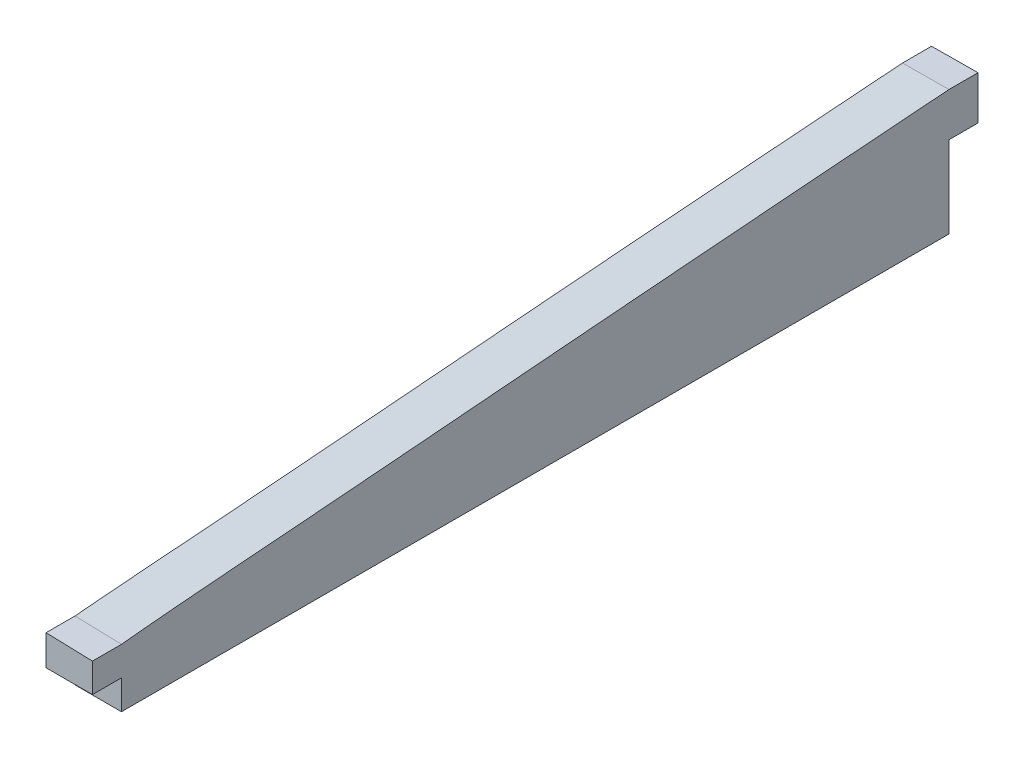
ISO-10303-21;
HEADER;
FILE_DESCRIPTION(('STEP AP214'),'2;1');
FILE_NAME('part.step','',(''),(''),'','','');
FILE_SCHEMA(('AUTOMOTIVE_DESIGN { 1 0 10303 214 1 1 1 1 }'));
ENDSEC;
DATA;
#1=APPLICATION_CONTEXT('core data for automotive mechanical design processes');
#2=APPLICATION_PROTOCOL_DEFINITION('international standard','automotive_design',2000,#1);
#3=PRODUCT_CONTEXT('',#1,'mechanical');
#4=PRODUCT('Part','Part','',(#3));
#5=PRODUCT_RELATED_PRODUCT_CATEGORY('part','',(#4));
#6=PRODUCT_DEFINITION_FORMATION('','',#4);
#7=PRODUCT_DEFINITION_CONTEXT('part definition',#1,'design');
#8=PRODUCT_DEFINITION('design','',#6,#7);
#9=PRODUCT_DEFINITION_SHAPE('','',#8);
#10=(LENGTH_UNIT() NAMED_UNIT(*) SI_UNIT(.MILLI.,.METRE.));
#11=(NAMED_UNIT(*) PLANE_ANGLE_UNIT() SI_UNIT($,.RADIAN.));
#12=(NAMED_UNIT(*) SI_UNIT($,.STERADIAN.) SOLID_ANGLE_UNIT());
#13=UNCERTAINTY_MEASURE_WITH_UNIT(LENGTH_MEASURE(1.E-05),#10,'distance_accuracy_value','');
#14=(GEOMETRIC_REPRESENTATION_CONTEXT(3) GLOBAL_UNCERTAINTY_ASSIGNED_CONTEXT((#13)) GLOBAL_UNIT_ASSIGNED_CONTEXT((#10,
#11,#12)) REPRESENTATION_CONTEXT('',''));
#15=CARTESIAN_POINT('',(0.,0.,0.));
#16=DIRECTION('',(0.,0.,1.));
#17=DIRECTION('',(1.,0.,0.));
#18=AXIS2_PLACEMENT_3D('',#15,#16,#17);
#19=CARTESIAN_POINT('',(-5.08000000000002,29.8672195959272,0.));
#20=DIRECTION('',(0.,0.,1.));
#21=DIRECTION('',(1.,0.,0.));
#22=AXIS2_PLACEMENT_3D('',#19,#20,#21);
#23=PLANE('',#22);
#24=DIRECTION('',(-1.,0.,0.));
#25=VECTOR('',#24,1.);
#26=CARTESIAN_POINT('',(-5.08000000000041,17.8512728585216,0.));
#27=LINE('',#26,#25);
#28=CARTESIAN_POINT('',(5.08000000000002,17.8512728585218,0.));
#29=VERTEX_POINT('',#28);
#30=CARTESIAN_POINT('',(-5.08000000000041,17.8512728585216,0.));
#31=VERTEX_POINT('',#30);
#32=EDGE_CURVE('E56',#29,#31,#27,.T.);
#33=ORIENTED_EDGE('',*,*,#32,.F.);
#34=DIRECTION('',(0.,-1.,0.));
#35=VECTOR('',#34,1.);
#36=CARTESIAN_POINT('',(5.08000000000002,29.8672195959272,0.));
#37=LINE('',#36,#35);
#38=CARTESIAN_POINT('',(5.08000000000002,0.,0.));
#39=VERTEX_POINT('',#38);
#40=EDGE_CURVE('E170',#29,#39,#37,.T.);
#41=ORIENTED_EDGE('',*,*,#40,.T.);
#42=DIRECTION('',(-1.,0.,0.));
#43=VECTOR('',#42,1.);
#44=CARTESIAN_POINT('',(-5.08000000000002,0.,0.));
#45=LINE('',#44,#43);
#46=CARTESIAN_POINT('',(-5.08000000000002,0.,0.));
#47=VERTEX_POINT('',#46);
#48=EDGE_CURVE('E118',#39,#47,#45,.T.);
#49=ORIENTED_EDGE('',*,*,#48,.T.);
#50=DIRECTION('',(0.,-1.,0.));
#51=VECTOR('',#50,1.);
#52=CARTESIAN_POINT('',(-5.08000000000002,29.8672195959272,0.));
#53=LINE('',#52,#51);
#54=EDGE_CURVE('E115',#31,#47,#53,.T.);
#55=ORIENTED_EDGE('',*,*,#54,.F.);
#56=EDGE_LOOP('',(#33,#41,#49,#55));
#57=FACE_BOUND('',#56,.T.);
#58=ADVANCED_FACE('F36',(#57),#23,.F.);
#59=CARTESIAN_POINT('',(-5.08000000000003,29.8672195959272,180.975));
#60=DIRECTION('',(0.,0.,-1.));
#61=DIRECTION('',(-1.,0.,0.));
#62=AXIS2_PLACEMENT_3D('',#59,#60,#61);
#63=PLANE('',#62);
#64=DIRECTION('',(1.,0.,0.));
#65=VECTOR('',#64,1.);
#66=CARTESIAN_POINT('',(5.08000000000003,6.42799957349636,180.975));
#67=LINE('',#66,#65);
#68=CARTESIAN_POINT('',(-5.08000000000003,6.42799957349636,180.975));
#69=VERTEX_POINT('',#68);
#70=CARTESIAN_POINT('',(5.08000000000003,6.42799957349636,180.975));
#71=VERTEX_POINT('',#70);
#72=EDGE_CURVE('E64',#69,#71,#67,.T.);
#73=ORIENTED_EDGE('',*,*,#72,.F.);
#74=DIRECTION('',(0.,-1.,0.));
#75=VECTOR('',#74,1.);
#76=CARTESIAN_POINT('',(-5.08000000000003,29.8672195959272,180.975));
#77=LINE('',#76,#75);
#78=CARTESIAN_POINT('',(-5.08000000000003,0.,180.975));
#79=VERTEX_POINT('',#78);
#80=EDGE_CURVE('E180',#69,#79,#77,.T.);
#81=ORIENTED_EDGE('',*,*,#80,.T.);
#82=DIRECTION('',(1.,0.,0.));
#83=VECTOR('',#82,1.);
#84=CARTESIAN_POINT('',(-5.08000000000003,0.,180.975));
#85=LINE('',#84,#83);
#86=CARTESIAN_POINT('',(5.08000000000003,0.,180.975));
#87=VERTEX_POINT('',#86);
#88=EDGE_CURVE('E177',#79,#87,#85,.T.);
#89=ORIENTED_EDGE('',*,*,#88,.T.);
#90=DIRECTION('',(0.,-1.,0.));
#91=VECTOR('',#90,1.);
#92=CARTESIAN_POINT('',(5.08000000000003,29.8672195959272,180.975));
#93=LINE('',#92,#91);
#94=EDGE_CURVE('E176',#71,#87,#93,.T.);
#95=ORIENTED_EDGE('',*,*,#94,.F.);
#96=EDGE_LOOP('',(#73,#81,#89,#95));
#97=FACE_BOUND('',#96,.T.);
#98=ADVANCED_FACE('F198',(#97),#63,.F.);
#99=CARTESIAN_POINT('',(5.08000000000003,29.8672195959272,180.975));
#100=DIRECTION('',(-1.,0.,0.));
#101=DIRECTION('',(0.,0.,1.));
#102=AXIS2_PLACEMENT_3D('',#99,#100,#101);
#103=PLANE('',#102);
#104=CARTESIAN_POINT('',(5.08000000000003,12.7779995734964,180.975));
#105=CARTESIAN_POINT('',(5.08000000000003,12.8382991883627,180.403374813908));
#106=CARTESIAN_POINT('',(5.08000000000003,12.8974534548264,179.831629993621));
#107=CARTESIAN_POINT('',(5.08000000000003,13.0137066544889,178.68793316957));
#108=CARTESIAN_POINT('',(5.08000000000003,13.0708055943665,178.115981166484));
#109=CARTESIAN_POINT('',(5.08000000000003,13.2393712126645,176.399875566769));
#110=CARTESIAN_POINT('',(5.08000000000003,13.3481086383278,175.255453760214));
#111=CARTESIAN_POINT('',(5.08000000000003,13.5599041673121,172.966184598955));
#112=CARTESIAN_POINT('',(5.08000000000003,13.6629627438774,171.82133728774));
#113=CARTESIAN_POINT('',(5.08000000000003,13.8647443532709,169.531256604676));
#114=CARTESIAN_POINT('',(5.08000000000003,13.9634673662054,168.386023231081));
#115=CARTESIAN_POINT('',(5.08000000000003,14.1576822312848,166.095293888526));
#116=CARTESIAN_POINT('',(5.08000000000003,14.2531741123514,164.94979792201));
#117=CARTESIAN_POINT('',(5.08000000000003,14.4418351554362,162.658614593164));
#118=CARTESIAN_POINT('',(5.08000000000003,14.5350043161028,161.512927230722));
#119=CARTESIAN_POINT('',(5.08000000000003,14.719761576717,159.221416975842));
#120=CARTESIAN_POINT('',(5.08000000000003,14.8113496651902,158.07559408248));
#121=CARTESIAN_POINT('',(5.08000000000003,14.9935355085373,155.783869326672));
#122=CARTESIAN_POINT('',(5.08000000000003,15.0841332630799,154.6379674642));
#123=CARTESIAN_POINT('',(5.08000000000003,15.3551840318426,151.200197901723));
#124=CARTESIAN_POINT('',(5.08000000000003,15.5348941101149,148.908271759918));
#125=CARTESIAN_POINT('',(5.08000000000003,15.8949960975372,144.324496985153));
#126=CARTESIAN_POINT('',(5.08000000000002,16.075387999569,142.032648351635));
#127=CARTESIAN_POINT('',(5.08000000000002,16.4383130935733,137.449119159687));
#128=CARTESIAN_POINT('',(5.08000000000003,16.6208462865159,135.157438601334));
#129=CARTESIAN_POINT('',(5.08000000000002,16.9887048316705,130.57430049145));
#130=CARTESIAN_POINT('',(5.08000000000002,17.1740301853429,128.282842940037));
#131=CARTESIAN_POINT('',(5.08000000000002,17.5464895938756,123.700073587961));
#132=CARTESIAN_POINT('',(5.08000000000003,17.7336236499639,121.4087617874));
#133=CARTESIAN_POINT('',(5.08000000000002,18.1089542630778,116.826225131436));
#134=CARTESIAN_POINT('',(5.08000000000001,18.2971508201751,114.535000276041));
#135=CARTESIAN_POINT('',(5.08000000000001,18.6778434302025,109.905957173955));
#136=CARTESIAN_POINT('',(5.08000000000002,18.870349033239,107.568139713455));
#137=CARTESIAN_POINT('',(5.08000000000003,19.255351211041,102.892504050342));
#138=CARTESIAN_POINT('',(5.08000000000002,19.4478477858064,100.554685847728));
#139=CARTESIAN_POINT('',(5.08000000000002,20.024715909876,93.5411795045427));
#140=CARTESIAN_POINT('',(5.08000000000002,20.4084658188024,88.8654401146667));
#141=CARTESIAN_POINT('',(5.08000000000002,21.1721440075363,79.5136596709427));
#142=CARTESIAN_POINT('',(5.08000000000001,21.5520722961737,74.8376186178169));
#143=CARTESIAN_POINT('',(5.08000000000003,22.3068898716845,65.4851286241201));
#144=CARTESIAN_POINT('',(5.08000000000005,22.681779157619,60.8086796834732));
#145=CARTESIAN_POINT('',(5.08000000000005,23.4258621710307,51.4552706656357));
#146=CARTESIAN_POINT('',(5.08000000000003,23.7950558284277,46.7783105828679));
#147=CARTESIAN_POINT('',(5.08000000000001,24.5274584870906,37.4239225156153));
#148=CARTESIAN_POINT('',(5.08000000000001,24.890667489298,32.7464945312044));
#149=CARTESIAN_POINT('',(5.08000000000002,25.611049272443,23.3911494217023));
#150=CARTESIAN_POINT('',(5.08000000000003,25.9682220220875,18.7132322942018));
#151=CARTESIAN_POINT('',(5.08,26.6766527431109,9.35694858913325));
#152=CARTESIAN_POINT('',(5.07999999999997,27.0279107125112,4.67858201141533));
#153=CARTESIAN_POINT('',(5.07999999999989,27.3762728585213,0.));
#154=B_SPLINE_CURVE_WITH_KNOTS('',3,(#104,#105,#106,#107,#108,#109,#110,#111,#112,#113,#114,
#115,#116,#117,#118,#119,#120,#121,#122,#123,#124,#125,#126,#127,#128,#129,#130,#131,#132,#133,
#134,#135,#136,#137,#138,#139,#140,#141,#142,#143,#144,#145,#146,#147,#148,#149,#150,#151,#152,
#153),.UNSPECIFIED.,.F.,.F.,(4,2,2,2,2,2,2,2,2,2,2,2,2,2,2,2,2,2,2,2,2,2,2,2,4),(0.,
1.7243875061308,3.44876940821637,6.89747705010003,10.3458968593822,13.7943324900311,
17.2427372457457,20.6911440082173,24.1395757865123,27.5880087183826,34.4848912345522,
41.3817019453676,48.2785157813538,55.1753332247999,62.0721553512959,68.9689779432532,
76.0061677142499,83.0433575185863,97.1177385903501,111.192087135186,125.266438302185,
139.340962505081,153.415484493538,167.490079424474,181.56467906373),.UNSPECIFIED.);
#155=CARTESIAN_POINT('',(5.08000000000003,12.7779995734964,180.975));
#156=VERTEX_POINT('',#155);
#157=CARTESIAN_POINT('',(5.08000000000002,27.3762728585213,0.));
#158=VERTEX_POINT('',#157);
#159=EDGE_CURVE('E48',#156,#158,#154,.T.);
#160=ORIENTED_EDGE('',*,*,#159,.F.);
#161=DIRECTION('',(0.,0.,-1.));
#162=VECTOR('',#161,1.);
#163=CARTESIAN_POINT('',(5.08000000000003,12.7779995734964,199.463134991118));
#164=LINE('',#163,#162);
#165=CARTESIAN_POINT('',(5.08000000000003,12.7779995734964,187.325));
#166=VERTEX_POINT('',#165);
#167=EDGE_CURVE('E156',#166,#156,#164,.T.);
#168=ORIENTED_EDGE('',*,*,#167,.F.);
#169=DIRECTION('',(0.,1.,0.));
#170=VECTOR('',#169,1.);
#171=CARTESIAN_POINT('',(5.08000000000003,6.42799957349636,187.325));
#172=LINE('',#171,#170);
#173=CARTESIAN_POINT('',(5.08000000000003,6.42799957349636,187.325));
#174=VERTEX_POINT('',#173);
#175=EDGE_CURVE('E336',#174,#166,#172,.T.);
#176=ORIENTED_EDGE('',*,*,#175,.F.);
#177=DIRECTION('',(0.,0.,-1.));
#178=VECTOR('',#177,1.);
#179=CARTESIAN_POINT('',(5.08000000000003,6.42799957349636,199.463134991118));
#180=LINE('',#179,#178);
#181=EDGE_CURVE('E305',#174,#71,#180,.T.);
#182=ORIENTED_EDGE('',*,*,#181,.T.);
#183=ORIENTED_EDGE('',*,*,#94,.T.);
#184=DIRECTION('',(0.,0.,-1.));
#185=VECTOR('',#184,1.);
#186=CARTESIAN_POINT('',(5.08000000000003,0.,180.975));
#187=LINE('',#186,#185);
#188=EDGE_CURVE('E171',#87,#39,#187,.T.);
#189=ORIENTED_EDGE('',*,*,#188,.T.);
#190=ORIENTED_EDGE('',*,*,#40,.F.);
#191=DIRECTION('',(0.,0.,1.));
#192=VECTOR('',#191,1.);
#193=CARTESIAN_POINT('',(5.07999999999963,17.8512728585218,-20.2766372466583));
#194=LINE('',#193,#192);
#195=CARTESIAN_POINT('',(5.07999999999963,17.8512728585218,-6.35));
#196=VERTEX_POINT('',#195);
#197=EDGE_CURVE('E132',#196,#29,#194,.T.);
#198=ORIENTED_EDGE('',*,*,#197,.F.);
#199=DIRECTION('',(0.,1.,0.));
#200=VECTOR('',#199,1.);
#201=CARTESIAN_POINT('',(5.07999999999942,27.3762728585218,-6.35));
#202=LINE('',#201,#200);
#203=CARTESIAN_POINT('',(5.07999999999942,27.3762728585218,-6.35));
#204=VERTEX_POINT('',#203);
#205=EDGE_CURVE('E149',#196,#204,#202,.T.);
#206=ORIENTED_EDGE('',*,*,#205,.T.);
#207=DIRECTION('',(0.,0.,1.));
#208=VECTOR('',#207,1.);
#209=CARTESIAN_POINT('',(5.07999999999942,27.3762728585218,-20.2766372466583));
#210=LINE('',#209,#208);
#211=EDGE_CURVE('E357',#204,#158,#210,.T.);
#212=ORIENTED_EDGE('',*,*,#211,.T.);
#213=EDGE_LOOP('',(#160,#168,#176,#182,#183,#189,#190,#198,#206,#212));
#214=FACE_BOUND('',#213,.T.);
#215=ADVANCED_FACE('F194',(#214),#103,.F.);
#216=CARTESIAN_POINT('',(-5.08000000000003,29.8672195959272,180.975));
#217=DIRECTION('',(1.,0.,0.));
#218=DIRECTION('',(0.,0.,-1.));
#219=AXIS2_PLACEMENT_3D('',#216,#217,#218);
#220=PLANE('',#219);
#221=CARTESIAN_POINT('',(-5.08000000000003,27.3141296637168,0.));
#222=CARTESIAN_POINT('',(-5.08000000000002,27.1299924827706,2.51456077509151));
#223=CARTESIAN_POINT('',(-5.08000000000002,26.9450511232346,5.02906268642073));
#224=CARTESIAN_POINT('',(-5.08000000000002,26.573525718759,10.0579447547888));
#225=CARTESIAN_POINT('',(-5.08000000000002,26.3869416740738,12.5723249118464));
#226=CARTESIAN_POINT('',(-5.08000000000002,26.0120965312324,17.6009599934321));
#227=CARTESIAN_POINT('',(-5.08000000000002,25.82383543323,20.1152149179716));
#228=CARTESIAN_POINT('',(-5.08000000000002,25.4456107189623,25.1435799591833));
#229=CARTESIAN_POINT('',(-5.08000000000002,25.2556471139842,27.6576900767044));
#230=CARTESIAN_POINT('',(-5.08000000000002,24.8739973827681,32.6857797449453));
#231=CARTESIAN_POINT('',(-5.08000000000002,24.6823112564146,35.1997592956564));
#232=CARTESIAN_POINT('',(-5.08000000000001,24.2972093547138,40.227586289301));
#233=CARTESIAN_POINT('',(-5.08,24.1037935790965,42.7414337322138));
#234=CARTESIAN_POINT('',(-5.07999999999999,23.6180920845877,49.0259677432193));
#235=CARTESIAN_POINT('',(-5.08000000000001,23.3247284189315,52.7965710510632));
#236=CARTESIAN_POINT('',(-5.08000000000003,22.7342200830961,60.3374816240146));
#237=CARTESIAN_POINT('',(-5.08000000000002,22.4370754127744,64.1077888891108));
#238=CARTESIAN_POINT('',(-5.08000000000002,21.8392402374749,71.6481209718459));
#239=CARTESIAN_POINT('',(-5.08000000000002,21.5385497336459,75.4181457895758));
#240=CARTESIAN_POINT('',(-5.08000000000002,20.934047665796,82.9579586937744));
#241=CARTESIAN_POINT('',(-5.08000000000002,20.6302360905445,86.7277467793421));
#242=CARTESIAN_POINT('',(-5.08000000000002,20.0201918779795,94.2671270173561));
#243=CARTESIAN_POINT('',(-5.08000000000002,19.7139592405723,98.0367191697948));
#244=CARTESIAN_POINT('',(-5.08000000000003,19.1001671767199,105.575795621875));
#245=CARTESIAN_POINT('',(-5.08000000000005,18.7926077501477,109.345279921506));
#246=CARTESIAN_POINT('',(-5.08000000000005,18.1778097984258,116.884272464915));
#247=CARTESIAN_POINT('',(-5.08000000000003,17.8705712730744,120.653780708677));
#248=CARTESIAN_POINT('',(-5.08000000000002,17.4118375538077,126.308214897747));
#249=CARTESIAN_POINT('',(-5.08000000000002,17.2592803545102,128.193054570543));
#250=CARTESIAN_POINT('',(-5.08000000000003,16.9553108992211,131.962826418339));
#251=CARTESIAN_POINT('',(-5.08000000000002,16.8038986432976,133.847758593344));
#252=CARTESIAN_POINT('',(-5.08000000000002,16.5027085858611,137.617756201157));
#253=CARTESIAN_POINT('',(-5.08000000000002,16.3529307864615,139.502821634134));
#254=CARTESIAN_POINT('',(-5.08000000000002,16.0556996409069,143.273135084307));
#255=CARTESIAN_POINT('',(-5.08000000000003,15.9082462938089,145.158383101429));
#256=CARTESIAN_POINT('',(-5.08000000000003,15.6641536855625,148.30058938594));
#257=CARTESIAN_POINT('',(-5.08000000000003,15.5669601682852,149.557504677398));
#258=CARTESIAN_POINT('',(-5.08000000000003,15.3732302796217,152.07138643436));
#259=CARTESIAN_POINT('',(-5.08000000000003,15.2766939085249,153.328352899886));
#260=CARTESIAN_POINT('',(-5.08000000000003,15.0839706917643,155.842314157136));
#261=CARTESIAN_POINT('',(-5.08000000000003,14.9877838465353,157.099308948894));
#262=CARTESIAN_POINT('',(-5.08000000000003,14.7953268154229,159.61329211539));
#263=CARTESIAN_POINT('',(-5.08000000000003,14.6990566295429,160.870280490128));
#264=CARTESIAN_POINT('',(-5.08000000000003,14.5058546727644,163.384204959285));
#265=CARTESIAN_POINT('',(-5.08000000000003,14.4089229026711,164.641141053766));
#266=CARTESIAN_POINT('',(-5.08000000000003,14.2136409545935,167.154899268506));
#267=CARTESIAN_POINT('',(-5.08000000000003,14.1152907812608,168.411721389125));
#268=CARTESIAN_POINT('',(-5.08000000000003,13.916197424605,170.925184571065));
#269=CARTESIAN_POINT('',(-5.08000000000003,13.815454226244,172.1818256312));
#270=CARTESIAN_POINT('',(-5.08000000000003,13.6103437276504,174.694817259567));
#271=CARTESIAN_POINT('',(-5.08000000000003,13.5059764175961,175.951167827003));
#272=CARTESIAN_POINT('',(-5.08000000000003,13.3455420708885,177.83537382627));
#273=CARTESIAN_POINT('',(-5.08000000000003,13.2914162570934,178.463394424337));
#274=CARTESIAN_POINT('',(-5.08000000000003,13.1816343940206,179.71930294562));
#275=CARTESIAN_POINT('',(-5.08000000000003,13.1259783418817,180.347190868587));
#276=CARTESIAN_POINT('',(-5.08000000000003,13.069439256472,180.975));
#277=B_SPLINE_CURVE_WITH_KNOTS('',3,(#221,#222,#223,#224,#225,#226,#227,#228,#229,#230,#231,
#232,#233,#234,#235,#236,#237,#238,#239,#240,#241,#242,#243,#244,#245,#246,#247,#248,#249,#250,
#251,#252,#253,#254,#255,#256,#257,#258,#259,#260,#261,#262,#263,#264,#265,#266,#267,#268,#269,
#270,#271,#272,#273,#274,#275,#276),.UNSPECIFIED.,.F.,.F.,(4,2,2,2,2,2,2,2,2,2,2,2,2,2,2,2,2,2,
2,2,2,2,2,2,2,2,2,4),(0.,7.56388128819282,15.1277614045774,22.6916408272577,30.2554701405561,
37.8192999608679,45.3831309617243,56.7291239293901,68.0751173246764,79.4211070438666,
90.7671376038707,102.113168603622,113.459200689283,124.805225637686,130.47823594012,
136.15124658006,141.824264554133,147.497280226556,151.279282636557,155.061286711617,
158.843295490111,162.625304117307,166.407308141883,170.189299766275,173.971315163253,
177.753340810595,179.64438520085,181.53543312729),.UNSPECIFIED.);
#278=CARTESIAN_POINT('',(-5.08000000000002,27.3141296637168,0.));
#279=VERTEX_POINT('',#278);
#280=CARTESIAN_POINT('',(-5.08000000000003,13.069439256472,180.975));
#281=VERTEX_POINT('',#280);
#282=EDGE_CURVE('E11',#279,#281,#277,.T.);
#283=ORIENTED_EDGE('',*,*,#282,.F.);
#284=DIRECTION('',(0.,0.,1.));
#285=VECTOR('',#284,1.);
#286=CARTESIAN_POINT('',(-5.08000000000062,27.3141296637158,-20.2766372466583));
#287=LINE('',#286,#285);
#288=CARTESIAN_POINT('',(-5.08000000000062,27.3141296637158,-6.35));
#289=VERTEX_POINT('',#288);
#290=EDGE_CURVE('E150',#289,#279,#287,.T.);
#291=ORIENTED_EDGE('',*,*,#290,.F.);
#292=DIRECTION('',(0.,-1.,0.));
#293=VECTOR('',#292,1.);
#294=CARTESIAN_POINT('',(-5.08000000000041,17.8512728585216,-6.35));
#295=LINE('',#294,#293);
#296=CARTESIAN_POINT('',(-5.08000000000041,17.8512728585216,-6.35));
#297=VERTEX_POINT('',#296);
#298=EDGE_CURVE('E129',#289,#297,#295,.T.);
#299=ORIENTED_EDGE('',*,*,#298,.T.);
#300=DIRECTION('',(0.,0.,1.));
#301=VECTOR('',#300,1.);
#302=CARTESIAN_POINT('',(-5.08000000000041,17.8512728585216,-20.2766372466583));
#303=LINE('',#302,#301);
#304=EDGE_CURVE('E126',#297,#31,#303,.T.);
#305=ORIENTED_EDGE('',*,*,#304,.T.);
#306=ORIENTED_EDGE('',*,*,#54,.T.);
#307=DIRECTION('',(0.,0.,1.));
#308=VECTOR('',#307,1.);
#309=CARTESIAN_POINT('',(-5.08000000000003,0.,180.975));
#310=LINE('',#309,#308);
#311=EDGE_CURVE('E122',#47,#79,#310,.T.);
#312=ORIENTED_EDGE('',*,*,#311,.T.);
#313=ORIENTED_EDGE('',*,*,#80,.F.);
#314=DIRECTION('',(0.,0.,-1.));
#315=VECTOR('',#314,1.);
#316=CARTESIAN_POINT('',(-5.08000000000003,6.42799957349636,199.463134991118));
#317=LINE('',#316,#315);
#318=CARTESIAN_POINT('',(-5.08000000000003,6.42799957349636,187.325));
#319=VERTEX_POINT('',#318);
#320=EDGE_CURVE('E155',#319,#69,#317,.T.);
#321=ORIENTED_EDGE('',*,*,#320,.F.);
#322=DIRECTION('',(0.,-1.,0.));
#323=VECTOR('',#322,1.);
#324=CARTESIAN_POINT('',(-5.08000000000004,13.069439256472,187.325));
#325=LINE('',#324,#323);
#326=CARTESIAN_POINT('',(-5.08000000000004,13.069439256472,187.325));
#327=VERTEX_POINT('',#326);
#328=EDGE_CURVE('E343',#327,#319,#325,.T.);
#329=ORIENTED_EDGE('',*,*,#328,.F.);
#330=DIRECTION('',(0.,0.,-1.));
#331=VECTOR('',#330,1.);
#332=CARTESIAN_POINT('',(-5.08000000000004,13.069439256472,199.463134991118));
#333=LINE('',#332,#331);
#334=EDGE_CURVE('E151',#327,#281,#333,.T.);
#335=ORIENTED_EDGE('',*,*,#334,.T.);
#336=EDGE_LOOP('',(#283,#291,#299,#305,#306,#312,#313,#321,#329,#335));
#337=FACE_BOUND('',#336,.T.);
#338=ADVANCED_FACE('F127',(#337),#220,.F.);
#339=CARTESIAN_POINT('',(0.,0.,0.));
#340=DIRECTION('',(0.,1.,0.));
#341=DIRECTION('',(0.,0.,1.));
#342=AXIS2_PLACEMENT_3D('',#339,#340,#341);
#343=PLANE('',#342);
#344=ORIENTED_EDGE('',*,*,#88,.F.);
#345=ORIENTED_EDGE('',*,*,#311,.F.);
#346=ORIENTED_EDGE('',*,*,#48,.F.);
#347=ORIENTED_EDGE('',*,*,#188,.F.);
#348=EDGE_LOOP('',(#344,#345,#346,#347));
#349=FACE_BOUND('',#348,.T.);
#350=ADVANCED_FACE('F231',(#349),#343,.F.);
#351=CARTESIAN_POINT('',(426.587707478517,0.805593780103232,0.));
#352=CARTESIAN_POINT('',(96.6320286366435,0.805593780103343,180.975));
#353=CARTESIAN_POINT('',(389.297242931251,15.7316618460275,0.));
#354=CARTESIAN_POINT('',(76.2302612248154,6.19285867283064,180.975));
#355=CARTESIAN_POINT('',(302.689349176176,21.7368507184805,0.));
#356=CARTESIAN_POINT('',(27.9804477230702,13.41528384639,180.975));
#357=CARTESIAN_POINT('',(192.92160043024,25.6426493437354,0.));
#358=CARTESIAN_POINT('',(-28.6357028374783,13.4027033679866,180.975));
#359=CARTESIAN_POINT('',(-59.9709949090405,29.8662195959272,0.));
#360=CARTESIAN_POINT('',(-158.731816648908,13.3279414749589,180.975));
#361=CARTESIAN_POINT('',(-249.841898030648,22.7196812991826,0.));
#362=CARTESIAN_POINT('',(-260.60149153677,12.5973349350484,180.975));
#363=CARTESIAN_POINT('',(-431.73484031015,10.3305937801039,0.));
#364=CARTESIAN_POINT('',(-354.767844288553,5.40386964217285,180.975));
#365=B_SPLINE_SURFACE_WITH_KNOTS('',3,1,((#351,#352),(#353,#354),(#355,#356),(#357,#358),(#359,
#360),(#361,#362),(#363,#364)),.UNSPECIFIED.,.F.,.F.,.F.,(4,1,1,1,4),(2,2),(0.,
0.138221334267563,0.3235363097206,0.374686955614901,1.),(0.,1.),.UNSPECIFIED.);
#366=CARTESIAN_POINT('',(-354.767844288553,5.40386964217285,180.975));
#367=CARTESIAN_POINT('',(-260.60149153677,12.5973349350484,180.975));
#368=CARTESIAN_POINT('',(-158.731816648908,13.3279414749589,180.975));
#369=CARTESIAN_POINT('',(-28.6357028374783,13.4027033679866,180.975));
#370=CARTESIAN_POINT('',(27.9804477230702,13.41528384639,180.975));
#371=CARTESIAN_POINT('',(76.2302612248154,6.19285867283064,180.975));
#372=CARTESIAN_POINT('',(96.6320286366435,0.805593780103343,180.975));
#373=B_SPLINE_CURVE_WITH_KNOTS('',3,(#366,#367,#368,#369,#370,#371,#372),.UNSPECIFIED.,.F.,.F.,
(4,1,1,1,4),(0.,0.625313044385099,0.6764636902794,0.861778665732437,1.),.UNSPECIFIED.);
#374=EDGE_CURVE('E168',#281,#156,#373,.T.);
#375=CARTESIAN_POINT('',(-431.73484031015,10.3305937801039,0.));
#376=CARTESIAN_POINT('',(-249.841898030648,22.7196812991826,0.));
#377=CARTESIAN_POINT('',(-7.95649323387476,31.8239899656692,0.));
#378=CARTESIAN_POINT('',(288.996760208518,22.6862628256054,0.));
#379=CARTESIAN_POINT('',(389.297242931251,15.7316618460275,0.));
#380=CARTESIAN_POINT('',(426.587707478517,0.805593780103232,0.));
#381=B_SPLINE_CURVE_WITH_KNOTS('',3,(#375,#376,#377,#378,#379,#380),.UNSPECIFIED.,.F.,.F.,(4,1,
1,4),(0.,0.625313044385099,0.861778665732437,1.),.UNSPECIFIED.);
#382=EDGE_CURVE('E175',#279,#158,#381,.T.);
#383=ORIENTED_EDGE('',*,*,#374,.T.);
#384=ORIENTED_EDGE('',*,*,#159,.T.);
#385=ORIENTED_EDGE('',*,*,#382,.F.);
#386=ORIENTED_EDGE('',*,*,#282,.T.);
#387=EDGE_LOOP('',(#383,#384,#385,#386));
#388=FACE_BOUND('',#387,.T.);
#389=ADVANCED_FACE('F38',(#388),#365,.T.);
#390=CARTESIAN_POINT('',(5.08000000000003,12.7779995734964,199.463134991118));
#391=CARTESIAN_POINT('',(1.69506840573678,12.8962323031452,199.463134991118));
#392=CARTESIAN_POINT('',(-1.69173466999396,12.9919727179161,199.463134991118));
#393=CARTESIAN_POINT('',(-5.08000000000004,13.069439256472,199.463134991118));
#394=B_SPLINE_CURVE_WITH_KNOTS('',3,(#390,#391,#392,#393),.UNSPECIFIED.,.F.,.F.,(4,4),
(0.773209919885761,0.795683006864415),.UNSPECIFIED.);
#395=DIRECTION('',(0.,0.,-1.));
#396=VECTOR('',#395,1.);
#397=SURFACE_OF_LINEAR_EXTRUSION('',#394,#396);
#398=CARTESIAN_POINT('',(5.08000000000003,12.7779995734964,187.325));
#399=CARTESIAN_POINT('',(1.69506840573678,12.8962323031452,187.325));
#400=CARTESIAN_POINT('',(-1.69173466999396,12.9919727179161,187.325));
#401=CARTESIAN_POINT('',(-5.08000000000004,13.069439256472,187.325));
#402=B_SPLINE_CURVE_WITH_KNOTS('',3,(#398,#399,#400,#401),.UNSPECIFIED.,.F.,.F.,(4,4),
(0.773209919885761,0.795683006864415),.UNSPECIFIED.);
#403=EDGE_CURVE('E339',#166,#327,#402,.T.);
#404=ORIENTED_EDGE('',*,*,#403,.F.);
#405=ORIENTED_EDGE('',*,*,#167,.T.);
#406=ORIENTED_EDGE('',*,*,#374,.F.);
#407=ORIENTED_EDGE('',*,*,#334,.F.);
#408=EDGE_LOOP('',(#404,#405,#406,#407));
#409=FACE_BOUND('',#408,.T.);
#410=ADVANCED_FACE('F242',(#409),#397,.F.);
#411=CARTESIAN_POINT('',(5.08000000000003,6.42799957349636,199.463134991118));
#412=DIRECTION('',(0.,1.,0.));
#413=DIRECTION('',(-1.,0.,0.));
#414=AXIS2_PLACEMENT_3D('',#411,#412,#413);
#415=PLANE('',#414);
#416=DIRECTION('',(1.,0.,0.));
#417=VECTOR('',#416,1.);
#418=CARTESIAN_POINT('',(5.08000000000003,6.42799957349636,187.325));
#419=LINE('',#418,#417);
#420=EDGE_CURVE('E300',#319,#174,#419,.T.);
#421=ORIENTED_EDGE('',*,*,#420,.F.);
#422=ORIENTED_EDGE('',*,*,#320,.T.);
#423=ORIENTED_EDGE('',*,*,#72,.T.);
#424=ORIENTED_EDGE('',*,*,#181,.F.);
#425=EDGE_LOOP('',(#421,#422,#423,#424));
#426=FACE_BOUND('',#425,.T.);
#427=ADVANCED_FACE('F276',(#426),#415,.F.);
#428=CARTESIAN_POINT('',(-128.771490598677,13.1960485708758,187.325));
#429=DIRECTION('',(0.,0.,1.));
#430=DIRECTION('',(-1.,0.,0.));
#431=AXIS2_PLACEMENT_3D('',#428,#429,#430);
#432=PLANE('',#431);
#433=ORIENTED_EDGE('',*,*,#175,.T.);
#434=ORIENTED_EDGE('',*,*,#403,.T.);
#435=ORIENTED_EDGE('',*,*,#328,.T.);
#436=ORIENTED_EDGE('',*,*,#420,.T.);
#437=EDGE_LOOP('',(#433,#434,#435,#436));
#438=FACE_BOUND('',#437,.T.);
#439=ADVANCED_FACE('F214',(#438),#432,.T.);
#440=CARTESIAN_POINT('',(-5.08000000000041,17.8512728585216,-20.2766372466583));
#441=DIRECTION('',(0.,1.,0.));
#442=DIRECTION('',(-1.,0.,0.));
#443=AXIS2_PLACEMENT_3D('',#440,#441,#442);
#444=PLANE('',#443);
#445=ORIENTED_EDGE('',*,*,#304,.F.);
#446=DIRECTION('',(1.,0.,0.));
#447=VECTOR('',#446,1.);
#448=CARTESIAN_POINT('',(-5.08000000000041,17.8512728585216,-6.35));
#449=LINE('',#448,#447);
#450=EDGE_CURVE('E147',#297,#196,#449,.T.);
#451=ORIENTED_EDGE('',*,*,#450,.T.);
#452=ORIENTED_EDGE('',*,*,#197,.T.);
#453=ORIENTED_EDGE('',*,*,#32,.T.);
#454=EDGE_LOOP('',(#445,#451,#452,#453));
#455=FACE_BOUND('',#454,.T.);
#456=ADVANCED_FACE('F135',(#455),#444,.F.);
#457=CARTESIAN_POINT('',(35.8475072890864,-5833.48437464144,-20.2766372466583));
#458=DIRECTION('',(0.,0.,1.));
#459=DIRECTION('',(1.,0.,0.));
#460=AXIS2_PLACEMENT_3D('',#457,#458,#459);
#461=CYLINDRICAL_SURFACE('',#460,5860.94140637137);
#462=ORIENTED_EDGE('',*,*,#211,.F.);
#463=CARTESIAN_POINT('',(35.8475072890864,-5833.48437464144,-6.35));
#464=DIRECTION('',(0.,0.,1.));
#465=DIRECTION('',(1.,0.,0.));
#466=AXIS2_PLACEMENT_3D('',#463,#464,#465);
#467=CIRCLE('',#466,5860.94140637137);
#468=EDGE_CURVE('E359',#204,#289,#467,.T.);
#469=ORIENTED_EDGE('',*,*,#468,.T.);
#470=ORIENTED_EDGE('',*,*,#290,.T.);
#471=ORIENTED_EDGE('',*,*,#382,.T.);
#472=EDGE_LOOP('',(#462,#469,#470,#471));
#473=FACE_BOUND('',#472,.T.);
#474=ADVANCED_FACE('F252',(#473),#461,.T.);
#475=CARTESIAN_POINT('',(-0.610306340183484,27.3436380621064,-6.35));
#476=DIRECTION('',(0.,0.,1.));
#477=DIRECTION('',(-1.,0.,0.));
#478=AXIS2_PLACEMENT_3D('',#475,#476,#477);
#479=PLANE('',#478);
#480=ORIENTED_EDGE('',*,*,#468,.F.);
#481=ORIENTED_EDGE('',*,*,#205,.F.);
#482=ORIENTED_EDGE('',*,*,#450,.F.);
#483=ORIENTED_EDGE('',*,*,#298,.F.);
#484=EDGE_LOOP('',(#480,#481,#482,#483));
#485=FACE_BOUND('',#484,.T.);
#486=ADVANCED_FACE('F261',(#485),#479,.F.);
#487=CLOSED_SHELL('',(#58,#98,#215,#338,#350,#389,#410,#427,#439,#456,#474,#486));
#488=MANIFOLD_SOLID_BREP('B2',#487);
#489=ADVANCED_BREP_SHAPE_REPRESENTATION('',(#18,#488),#14);
#490=SHAPE_DEFINITION_REPRESENTATION(#9,#489);
ENDSEC;
END-ISO-10303-21;
